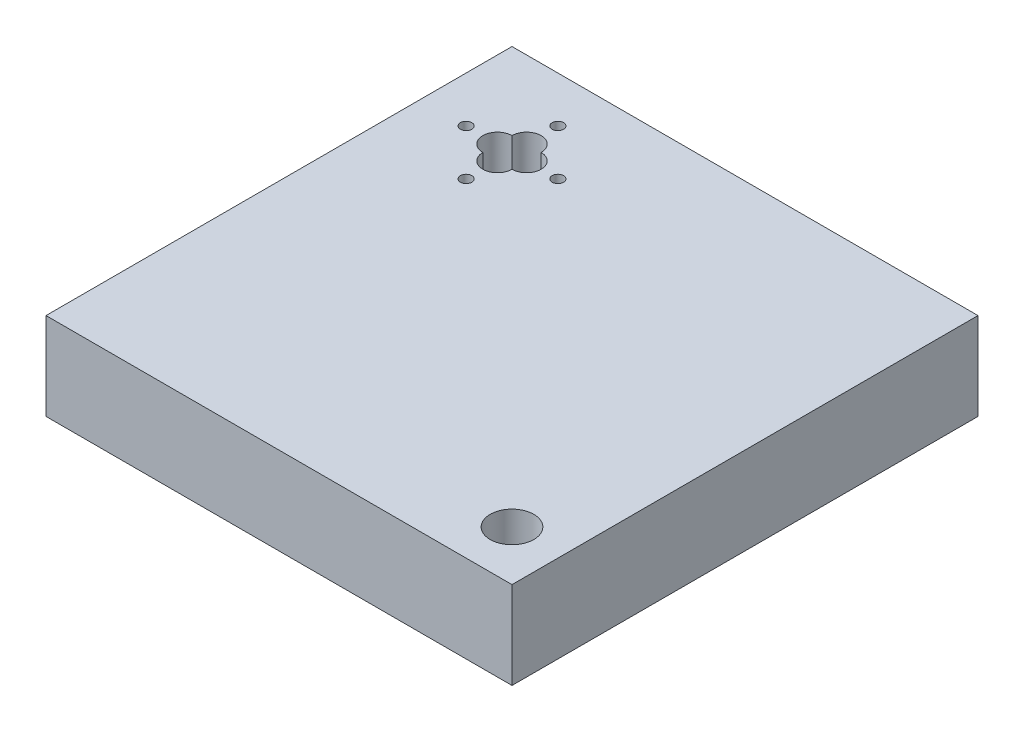
ISO-10303-21;
HEADER;
FILE_DESCRIPTION(('STEP AP214'),'2;1');
FILE_NAME('part.step','',(''),(''),'','','');
FILE_SCHEMA(('AUTOMOTIVE_DESIGN { 1 0 10303 214 1 1 1 1 }'));
ENDSEC;
DATA;
#1=APPLICATION_CONTEXT('core data for automotive mechanical design processes');
#2=APPLICATION_PROTOCOL_DEFINITION('international standard','automotive_design',2000,#1);
#3=PRODUCT_CONTEXT('',#1,'mechanical');
#4=PRODUCT('Part','Part','',(#3));
#5=PRODUCT_RELATED_PRODUCT_CATEGORY('part','',(#4));
#6=PRODUCT_DEFINITION_FORMATION('','',#4);
#7=PRODUCT_DEFINITION_CONTEXT('part definition',#1,'design');
#8=PRODUCT_DEFINITION('design','',#6,#7);
#9=PRODUCT_DEFINITION_SHAPE('','',#8);
#10=(LENGTH_UNIT() NAMED_UNIT(*) SI_UNIT(.MILLI.,.METRE.));
#11=(NAMED_UNIT(*) PLANE_ANGLE_UNIT() SI_UNIT($,.RADIAN.));
#12=(NAMED_UNIT(*) SI_UNIT($,.STERADIAN.) SOLID_ANGLE_UNIT());
#13=UNCERTAINTY_MEASURE_WITH_UNIT(LENGTH_MEASURE(1.E-05),#10,'distance_accuracy_value','');
#14=(GEOMETRIC_REPRESENTATION_CONTEXT(3) GLOBAL_UNCERTAINTY_ASSIGNED_CONTEXT((#13)) GLOBAL_UNIT_ASSIGNED_CONTEXT((#10,
#11,#12)) REPRESENTATION_CONTEXT('',''));
#15=CARTESIAN_POINT('',(0.,0.,0.));
#16=DIRECTION('',(0.,0.,1.));
#17=DIRECTION('',(1.,0.,0.));
#18=AXIS2_PLACEMENT_3D('',#15,#16,#17);
#19=CARTESIAN_POINT('',(81.6,-19.05,0.));
#20=DIRECTION('',(-1.,0.,0.));
#21=DIRECTION('',(0.,0.,1.));
#22=AXIS2_PLACEMENT_3D('',#19,#20,#21);
#23=PLANE('',#22);
#24=DIRECTION('',(0.,0.,1.));
#25=VECTOR('',#24,1.);
#26=CARTESIAN_POINT('',(81.6,0.,0.));
#27=LINE('',#26,#25);
#28=CARTESIAN_POINT('',(81.6,0.,-20.));
#29=VERTEX_POINT('',#28);
#30=CARTESIAN_POINT('',(81.6,0.,81.6));
#31=VERTEX_POINT('',#30);
#32=EDGE_CURVE('E156',#29,#31,#27,.T.);
#33=ORIENTED_EDGE('',*,*,#32,.T.);
#34=DIRECTION('',(0.,1.,0.));
#35=VECTOR('',#34,1.);
#36=CARTESIAN_POINT('',(81.6,-19.05,81.6));
#37=LINE('',#36,#35);
#38=CARTESIAN_POINT('',(81.6,-19.05,81.6));
#39=VERTEX_POINT('',#38);
#40=EDGE_CURVE('E11',#39,#31,#37,.T.);
#41=ORIENTED_EDGE('',*,*,#40,.F.);
#42=DIRECTION('',(0.,0.,1.));
#43=VECTOR('',#42,1.);
#44=CARTESIAN_POINT('',(81.6,-19.05,0.));
#45=LINE('',#44,#43);
#46=CARTESIAN_POINT('',(81.6,-19.05,-20.));
#47=VERTEX_POINT('',#46);
#48=EDGE_CURVE('E59',#47,#39,#45,.T.);
#49=ORIENTED_EDGE('',*,*,#48,.F.);
#50=DIRECTION('',(0.,1.,0.));
#51=VECTOR('',#50,1.);
#52=CARTESIAN_POINT('',(81.6,-19.05,-20.));
#53=LINE('',#52,#51);
#54=EDGE_CURVE('E122',#47,#29,#53,.T.);
#55=ORIENTED_EDGE('',*,*,#54,.T.);
#56=EDGE_LOOP('',(#33,#41,#49,#55));
#57=FACE_BOUND('',#56,.T.);
#58=ADVANCED_FACE('F39',(#57),#23,.F.);
#59=CARTESIAN_POINT('',(0.,-19.05,81.6));
#60=DIRECTION('',(0.,0.,1.));
#61=DIRECTION('',(1.,0.,0.));
#62=AXIS2_PLACEMENT_3D('',#59,#60,#61);
#63=PLANE('',#62);
#64=DIRECTION('',(1.,0.,0.));
#65=VECTOR('',#64,1.);
#66=CARTESIAN_POINT('',(0.,0.,81.6));
#67=LINE('',#66,#65);
#68=CARTESIAN_POINT('',(-20.,0.,81.6));
#69=VERTEX_POINT('',#68);
#70=EDGE_CURVE('E164',#69,#31,#67,.T.);
#71=ORIENTED_EDGE('',*,*,#70,.F.);
#72=DIRECTION('',(0.,1.,0.));
#73=VECTOR('',#72,1.);
#74=CARTESIAN_POINT('',(-20.,-19.05,81.6));
#75=LINE('',#74,#73);
#76=CARTESIAN_POINT('',(-20.,-19.05,81.6));
#77=VERTEX_POINT('',#76);
#78=EDGE_CURVE('E50',#77,#69,#75,.T.);
#79=ORIENTED_EDGE('',*,*,#78,.F.);
#80=DIRECTION('',(1.,0.,0.));
#81=VECTOR('',#80,1.);
#82=CARTESIAN_POINT('',(0.,-19.05,81.6));
#83=LINE('',#82,#81);
#84=EDGE_CURVE('E131',#77,#39,#83,.T.);
#85=ORIENTED_EDGE('',*,*,#84,.T.);
#86=ORIENTED_EDGE('',*,*,#40,.T.);
#87=EDGE_LOOP('',(#71,#79,#85,#86));
#88=FACE_BOUND('',#87,.T.);
#89=ADVANCED_FACE('F234',(#88),#63,.T.);
#90=CARTESIAN_POINT('',(-20.,-19.05,0.));
#91=DIRECTION('',(-1.,0.,0.));
#92=DIRECTION('',(0.,0.,1.));
#93=AXIS2_PLACEMENT_3D('',#90,#91,#92);
#94=PLANE('',#93);
#95=DIRECTION('',(0.,0.,1.));
#96=VECTOR('',#95,1.);
#97=CARTESIAN_POINT('',(-20.,0.,0.));
#98=LINE('',#97,#96);
#99=CARTESIAN_POINT('',(-20.,0.,-20.));
#100=VERTEX_POINT('',#99);
#101=EDGE_CURVE('E118',#100,#69,#98,.T.);
#102=ORIENTED_EDGE('',*,*,#101,.F.);
#103=DIRECTION('',(0.,1.,0.));
#104=VECTOR('',#103,1.);
#105=CARTESIAN_POINT('',(-20.,-19.05,-20.));
#106=LINE('',#105,#104);
#107=CARTESIAN_POINT('',(-20.,-19.05,-20.));
#108=VERTEX_POINT('',#107);
#109=EDGE_CURVE('E113',#108,#100,#106,.T.);
#110=ORIENTED_EDGE('',*,*,#109,.F.);
#111=DIRECTION('',(0.,0.,1.));
#112=VECTOR('',#111,1.);
#113=CARTESIAN_POINT('',(-20.,-19.05,0.));
#114=LINE('',#113,#112);
#115=EDGE_CURVE('E117',#108,#77,#114,.T.);
#116=ORIENTED_EDGE('',*,*,#115,.T.);
#117=ORIENTED_EDGE('',*,*,#78,.T.);
#118=EDGE_LOOP('',(#102,#110,#116,#117));
#119=FACE_BOUND('',#118,.T.);
#120=ADVANCED_FACE('F115',(#119),#94,.T.);
#121=CARTESIAN_POINT('',(0.,-19.05,3.18));
#122=DIRECTION('',(0.,1.,0.));
#123=DIRECTION('',(0.,0.,1.));
#124=AXIS2_PLACEMENT_3D('',#121,#122,#123);
#125=CYLINDRICAL_SURFACE('',#124,3.18000000000001);
#126=CARTESIAN_POINT('',(0.,0.,3.18));
#127=DIRECTION('',(0.,1.,0.));
#128=DIRECTION('',(0.,0.,1.));
#129=AXIS2_PLACEMENT_3D('',#126,#127,#128);
#130=CIRCLE('',#129,3.18000000000001);
#131=CARTESIAN_POINT('',(-3.18,0.,3.18));
#132=VERTEX_POINT('',#131);
#133=CARTESIAN_POINT('',(3.18,0.,3.18));
#134=VERTEX_POINT('',#133);
#135=EDGE_CURVE('E138',#132,#134,#130,.T.);
#136=ORIENTED_EDGE('',*,*,#135,.T.);
#137=DIRECTION('',(0.,1.,0.));
#138=VECTOR('',#137,1.);
#139=CARTESIAN_POINT('',(3.18,-19.05,3.18));
#140=LINE('',#139,#138);
#141=CARTESIAN_POINT('',(3.18,-19.05,3.18));
#142=VERTEX_POINT('',#141);
#143=EDGE_CURVE('E173',#142,#134,#140,.T.);
#144=ORIENTED_EDGE('',*,*,#143,.F.);
#145=CARTESIAN_POINT('',(0.,-19.05,3.18));
#146=DIRECTION('',(0.,1.,0.));
#147=DIRECTION('',(0.,0.,1.));
#148=AXIS2_PLACEMENT_3D('',#145,#146,#147);
#149=CIRCLE('',#148,3.18000000000001);
#150=CARTESIAN_POINT('',(-3.18,-19.05,3.18));
#151=VERTEX_POINT('',#150);
#152=EDGE_CURVE('E167',#151,#142,#149,.T.);
#153=ORIENTED_EDGE('',*,*,#152,.F.);
#154=DIRECTION('',(0.,1.,0.));
#155=VECTOR('',#154,1.);
#156=CARTESIAN_POINT('',(-3.18,-19.05,3.18));
#157=LINE('',#156,#155);
#158=EDGE_CURVE('E43',#151,#132,#157,.T.);
#159=ORIENTED_EDGE('',*,*,#158,.T.);
#160=EDGE_LOOP('',(#136,#144,#153,#159));
#161=FACE_BOUND('',#160,.T.);
#162=ADVANCED_FACE('F41',(#161),#125,.F.);
#163=CARTESIAN_POINT('',(3.18,-19.05,0.));
#164=DIRECTION('',(0.,1.,0.));
#165=DIRECTION('',(0.,0.,1.));
#166=AXIS2_PLACEMENT_3D('',#163,#164,#165);
#167=CYLINDRICAL_SURFACE('',#166,3.18);
#168=CARTESIAN_POINT('',(3.18,0.,0.));
#169=DIRECTION('',(0.,1.,0.));
#170=DIRECTION('',(0.,0.,1.));
#171=AXIS2_PLACEMENT_3D('',#168,#169,#170);
#172=CIRCLE('',#171,3.18);
#173=CARTESIAN_POINT('',(3.18,0.,-3.18));
#174=VERTEX_POINT('',#173);
#175=EDGE_CURVE('E149',#134,#174,#172,.T.);
#176=ORIENTED_EDGE('',*,*,#175,.T.);
#177=DIRECTION('',(0.,1.,0.));
#178=VECTOR('',#177,1.);
#179=CARTESIAN_POINT('',(3.18,-19.05,-3.18));
#180=LINE('',#179,#178);
#181=CARTESIAN_POINT('',(3.18,-19.05,-3.18));
#182=VERTEX_POINT('',#181);
#183=EDGE_CURVE('E177',#182,#174,#180,.T.);
#184=ORIENTED_EDGE('',*,*,#183,.F.);
#185=CARTESIAN_POINT('',(3.18,-19.05,0.));
#186=DIRECTION('',(0.,1.,0.));
#187=DIRECTION('',(0.,0.,1.));
#188=AXIS2_PLACEMENT_3D('',#185,#186,#187);
#189=CIRCLE('',#188,3.18);
#190=EDGE_CURVE('E199',#142,#182,#189,.T.);
#191=ORIENTED_EDGE('',*,*,#190,.F.);
#192=ORIENTED_EDGE('',*,*,#143,.T.);
#193=EDGE_LOOP('',(#176,#184,#191,#192));
#194=FACE_BOUND('',#193,.T.);
#195=ADVANCED_FACE('F198',(#194),#167,.F.);
#196=CARTESIAN_POINT('',(0.,-19.05,-3.18));
#197=DIRECTION('',(0.,1.,0.));
#198=DIRECTION('',(0.,0.,1.));
#199=AXIS2_PLACEMENT_3D('',#196,#197,#198);
#200=CYLINDRICAL_SURFACE('',#199,3.18);
#201=CARTESIAN_POINT('',(0.,0.,-3.18));
#202=DIRECTION('',(0.,1.,0.));
#203=DIRECTION('',(0.,0.,1.));
#204=AXIS2_PLACEMENT_3D('',#201,#202,#203);
#205=CIRCLE('',#204,3.18);
#206=CARTESIAN_POINT('',(-3.18,0.,-3.18));
#207=VERTEX_POINT('',#206);
#208=EDGE_CURVE('E146',#174,#207,#205,.T.);
#209=ORIENTED_EDGE('',*,*,#208,.T.);
#210=DIRECTION('',(0.,1.,0.));
#211=VECTOR('',#210,1.);
#212=CARTESIAN_POINT('',(-3.18,-19.05,-3.18));
#213=LINE('',#212,#211);
#214=CARTESIAN_POINT('',(-3.18,-19.05,-3.18));
#215=VERTEX_POINT('',#214);
#216=EDGE_CURVE('E180',#215,#207,#213,.T.);
#217=ORIENTED_EDGE('',*,*,#216,.F.);
#218=CARTESIAN_POINT('',(0.,-19.05,-3.18));
#219=DIRECTION('',(0.,1.,0.));
#220=DIRECTION('',(0.,0.,1.));
#221=AXIS2_PLACEMENT_3D('',#218,#219,#220);
#222=CIRCLE('',#221,3.18);
#223=EDGE_CURVE('E203',#182,#215,#222,.T.);
#224=ORIENTED_EDGE('',*,*,#223,.F.);
#225=ORIENTED_EDGE('',*,*,#183,.T.);
#226=EDGE_LOOP('',(#209,#217,#224,#225));
#227=FACE_BOUND('',#226,.T.);
#228=ADVANCED_FACE('F224',(#227),#200,.F.);
#229=CARTESIAN_POINT('',(70.7106781186546,-19.05,70.7106781186549));
#230=DIRECTION('',(0.,1.,0.));
#231=DIRECTION('',(0.,0.,1.));
#232=AXIS2_PLACEMENT_3D('',#229,#230,#231);
#233=CYLINDRICAL_SURFACE('',#232,4.7625);
#234=CARTESIAN_POINT('',(70.7106781186546,-19.05,70.7106781186549));
#235=DIRECTION('',(0.,1.,0.));
#236=DIRECTION('',(0.,0.,1.));
#237=AXIS2_PLACEMENT_3D('',#234,#235,#236);
#238=CIRCLE('',#237,4.7625);
#239=CARTESIAN_POINT('',(70.7106781186546,-19.05,75.4731781186549));
#240=VERTEX_POINT('',#239);
#241=EDGE_CURVE('E202',#240,#240,#238,.T.);
#242=CARTESIAN_POINT('',(70.7106781186546,0.,70.7106781186549));
#243=DIRECTION('',(0.,1.,0.));
#244=DIRECTION('',(0.,0.,1.));
#245=AXIS2_PLACEMENT_3D('',#242,#243,#244);
#246=CIRCLE('',#245,4.7625);
#247=CARTESIAN_POINT('',(70.7106781186546,0.,75.4731781186549));
#248=VERTEX_POINT('',#247);
#249=EDGE_CURVE('E152',#248,#248,#246,.T.);
#250=CARTESIAN_POINT('',(70.7106781186546,-19.05,75.4731781186549));
#251=CARTESIAN_POINT('',(70.7106781186546,-18.8515625,75.4731781186549));
#252=CARTESIAN_POINT('',(70.7106781186546,-18.653125,75.4731781186549));
#253=CARTESIAN_POINT('',(70.7106781186546,-18.25625,75.4731781186549));
#254=CARTESIAN_POINT('',(70.7106781186546,-18.0578125,75.4731781186549));
#255=CARTESIAN_POINT('',(70.7106781186546,-17.6609375,75.4731781186549));
#256=CARTESIAN_POINT('',(70.7106781186546,-17.4625,75.4731781186549));
#257=CARTESIAN_POINT('',(70.7106781186546,-17.065625,75.4731781186549));
#258=CARTESIAN_POINT('',(70.7106781186546,-16.8671875,75.4731781186549));
#259=CARTESIAN_POINT('',(70.7106781186546,-16.4703125,75.4731781186549));
#260=CARTESIAN_POINT('',(70.7106781186546,-16.271875,75.4731781186549));
#261=CARTESIAN_POINT('',(70.7106781186546,-15.875,75.4731781186549));
#262=CARTESIAN_POINT('',(70.7106781186546,-15.6765625,75.4731781186549));
#263=CARTESIAN_POINT('',(70.7106781186546,-15.2796875,75.4731781186549));
#264=CARTESIAN_POINT('',(70.7106781186546,-15.08125,75.4731781186549));
#265=CARTESIAN_POINT('',(70.7106781186546,-14.684375,75.4731781186549));
#266=CARTESIAN_POINT('',(70.7106781186546,-14.4859375,75.4731781186549));
#267=CARTESIAN_POINT('',(70.7106781186546,-14.0890625,75.4731781186549));
#268=CARTESIAN_POINT('',(70.7106781186546,-13.890625,75.4731781186549));
#269=CARTESIAN_POINT('',(70.7106781186546,-13.49375,75.4731781186549));
#270=CARTESIAN_POINT('',(70.7106781186546,-13.2953125,75.4731781186549));
#271=CARTESIAN_POINT('',(70.7106781186546,-12.8984375,75.4731781186549));
#272=CARTESIAN_POINT('',(70.7106781186546,-12.7,75.4731781186549));
#273=CARTESIAN_POINT('',(70.7106781186546,-12.303125,75.4731781186549));
#274=CARTESIAN_POINT('',(70.7106781186546,-12.1046875,75.4731781186549));
#275=CARTESIAN_POINT('',(70.7106781186546,-11.7078125,75.4731781186549));
#276=CARTESIAN_POINT('',(70.7106781186546,-11.509375,75.4731781186549));
#277=CARTESIAN_POINT('',(70.7106781186546,-11.1125,75.4731781186549));
#278=CARTESIAN_POINT('',(70.7106781186546,-10.9140625,75.4731781186549));
#279=CARTESIAN_POINT('',(70.7106781186546,-10.5171875,75.4731781186549));
#280=CARTESIAN_POINT('',(70.7106781186546,-10.31875,75.4731781186549));
#281=CARTESIAN_POINT('',(70.7106781186546,-9.921875,75.4731781186549));
#282=CARTESIAN_POINT('',(70.7106781186546,-9.7234375,75.4731781186549));
#283=CARTESIAN_POINT('',(70.7106781186546,-9.3265625,75.4731781186549));
#284=CARTESIAN_POINT('',(70.7106781186546,-9.128125,75.4731781186549));
#285=CARTESIAN_POINT('',(70.7106781186546,-8.73125,75.4731781186549));
#286=CARTESIAN_POINT('',(70.7106781186546,-8.5328125,75.4731781186549));
#287=CARTESIAN_POINT('',(70.7106781186546,-8.1359375,75.4731781186549));
#288=CARTESIAN_POINT('',(70.7106781186546,-7.9375,75.4731781186549));
#289=CARTESIAN_POINT('',(70.7106781186546,-7.540625,75.4731781186549));
#290=CARTESIAN_POINT('',(70.7106781186546,-7.3421875,75.4731781186549));
#291=CARTESIAN_POINT('',(70.7106781186546,-6.9453125,75.4731781186549));
#292=CARTESIAN_POINT('',(70.7106781186546,-6.746875,75.4731781186549));
#293=CARTESIAN_POINT('',(70.7106781186546,-6.35,75.4731781186549));
#294=CARTESIAN_POINT('',(70.7106781186546,-6.1515625,75.4731781186549));
#295=CARTESIAN_POINT('',(70.7106781186546,-5.7546875,75.4731781186549));
#296=CARTESIAN_POINT('',(70.7106781186546,-5.55625,75.4731781186549));
#297=CARTESIAN_POINT('',(70.7106781186546,-5.159375,75.4731781186549));
#298=CARTESIAN_POINT('',(70.7106781186546,-4.9609375,75.4731781186549));
#299=CARTESIAN_POINT('',(70.7106781186546,-4.5640625,75.4731781186549));
#300=CARTESIAN_POINT('',(70.7106781186546,-4.365625,75.4731781186549));
#301=CARTESIAN_POINT('',(70.7106781186546,-3.96875,75.4731781186549));
#302=CARTESIAN_POINT('',(70.7106781186546,-3.7703125,75.4731781186549));
#303=CARTESIAN_POINT('',(70.7106781186546,-3.3734375,75.4731781186549));
#304=CARTESIAN_POINT('',(70.7106781186546,-3.175,75.4731781186549));
#305=CARTESIAN_POINT('',(70.7106781186546,-2.778125,75.4731781186549));
#306=CARTESIAN_POINT('',(70.7106781186546,-2.5796875,75.4731781186549));
#307=CARTESIAN_POINT('',(70.7106781186546,-2.1828125,75.4731781186549));
#308=CARTESIAN_POINT('',(70.7106781186546,-1.984375,75.4731781186549));
#309=CARTESIAN_POINT('',(70.7106781186546,-1.5875,75.4731781186549));
#310=CARTESIAN_POINT('',(70.7106781186546,-1.3890625,75.4731781186549));
#311=CARTESIAN_POINT('',(70.7106781186546,-0.992187500000001,75.4731781186549));
#312=CARTESIAN_POINT('',(70.7106781186546,-0.793750000000001,75.4731781186549));
#313=CARTESIAN_POINT('',(70.7106781186546,-0.396875,75.4731781186549));
#314=CARTESIAN_POINT('',(70.7106781186546,-0.1984375,75.4731781186549));
#315=CARTESIAN_POINT('',(70.7106781186546,0.,75.4731781186549));
#316=B_SPLINE_CURVE_WITH_KNOTS('',3,(#250,#251,#252,#253,#254,#255,#256,#257,#258,#259,#260,
#261,#262,#263,#264,#265,#266,#267,#268,#269,#270,#271,#272,#273,#274,#275,#276,#277,#278,#279,
#280,#281,#282,#283,#284,#285,#286,#287,#288,#289,#290,#291,#292,#293,#294,#295,#296,#297,#298,
#299,#300,#301,#302,#303,#304,#305,#306,#307,#308,#309,#310,#311,#312,#313,#314,#315),
.UNSPECIFIED.,.F.,.F.,(4,2,2,2,2,2,2,2,2,2,2,2,2,2,2,2,2,2,2,2,2,2,2,2,2,2,2,2,2,2,2,2,4),(0.,
0.595312499999997,1.190625,1.7859375,2.38125,2.9765625,3.571875,4.1671875,4.7625,5.3578125,
5.953125,6.5484375,7.14375,7.7390625,8.334375,8.9296875,9.525,10.1203125,10.715625,11.3109375,
11.90625,12.5015625,13.096875,13.6921875,14.2875,14.8828125,15.478125,16.0734375,16.66875,
17.2640625,17.859375,18.4546875,19.05),.UNSPECIFIED.);
#317=EDGE_CURVE('BSEAM220',#240,#248,#316,.T.);
#318=ORIENTED_EDGE('',*,*,#241,.F.);
#319=ORIENTED_EDGE('',*,*,#249,.T.);
#320=ORIENTED_EDGE('',*,*,#317,.T.);
#321=ORIENTED_EDGE('',*,*,#317,.F.);
#322=EDGE_LOOP('',(#318,#320,#319,#321));
#323=FACE_BOUND('',#322,.T.);
#324=ADVANCED_FACE('F220',(#323),#233,.F.);
#325=CARTESIAN_POINT('',(-3.18,-19.05,0.));
#326=DIRECTION('',(0.,1.,0.));
#327=DIRECTION('',(0.,0.,1.));
#328=AXIS2_PLACEMENT_3D('',#325,#326,#327);
#329=CYLINDRICAL_SURFACE('',#328,3.18);
#330=CARTESIAN_POINT('',(-3.18,0.,0.));
#331=DIRECTION('',(0.,1.,0.));
#332=DIRECTION('',(0.,0.,1.));
#333=AXIS2_PLACEMENT_3D('',#330,#331,#332);
#334=CIRCLE('',#333,3.18);
#335=EDGE_CURVE('E142',#207,#132,#334,.T.);
#336=ORIENTED_EDGE('',*,*,#335,.T.);
#337=ORIENTED_EDGE('',*,*,#158,.F.);
#338=CARTESIAN_POINT('',(-3.18,-19.05,0.));
#339=DIRECTION('',(0.,1.,0.));
#340=DIRECTION('',(0.,0.,1.));
#341=AXIS2_PLACEMENT_3D('',#338,#339,#340);
#342=CIRCLE('',#341,3.18);
#343=EDGE_CURVE('E101',#215,#151,#342,.T.);
#344=ORIENTED_EDGE('',*,*,#343,.F.);
#345=ORIENTED_EDGE('',*,*,#216,.T.);
#346=EDGE_LOOP('',(#336,#337,#344,#345));
#347=FACE_BOUND('',#346,.T.);
#348=ADVANCED_FACE('F223',(#347),#329,.F.);
#349=CARTESIAN_POINT('',(0.,-19.05,-20.));
#350=DIRECTION('',(0.,0.,1.));
#351=DIRECTION('',(1.,0.,0.));
#352=AXIS2_PLACEMENT_3D('',#349,#350,#351);
#353=PLANE('',#352);
#354=DIRECTION('',(1.,0.,0.));
#355=VECTOR('',#354,1.);
#356=CARTESIAN_POINT('',(0.,0.,-20.));
#357=LINE('',#356,#355);
#358=EDGE_CURVE('E159',#100,#29,#357,.T.);
#359=ORIENTED_EDGE('',*,*,#358,.T.);
#360=ORIENTED_EDGE('',*,*,#54,.F.);
#361=DIRECTION('',(1.,0.,0.));
#362=VECTOR('',#361,1.);
#363=CARTESIAN_POINT('',(0.,-19.05,-20.));
#364=LINE('',#363,#362);
#365=EDGE_CURVE('E125',#108,#47,#364,.T.);
#366=ORIENTED_EDGE('',*,*,#365,.F.);
#367=ORIENTED_EDGE('',*,*,#109,.T.);
#368=EDGE_LOOP('',(#359,#360,#366,#367));
#369=FACE_BOUND('',#368,.T.);
#370=ADVANCED_FACE('F126',(#369),#353,.F.);
#371=CARTESIAN_POINT('',(0.,-19.05,0.));
#372=DIRECTION('',(0.,1.,0.));
#373=DIRECTION('',(0.,0.,1.));
#374=AXIS2_PLACEMENT_3D('',#371,#372,#373);
#375=PLANE('',#374);
#376=CARTESIAN_POINT('',(0.,-19.05,-10.));
#377=DIRECTION('',(0.,1.,0.));
#378=DIRECTION('',(0.,0.,1.));
#379=AXIS2_PLACEMENT_3D('',#376,#377,#378);
#380=CIRCLE('',#379,1.25);
#381=CARTESIAN_POINT('',(0.,-19.05,-8.75));
#382=VERTEX_POINT('',#381);
#383=EDGE_CURVE('E361',#382,#382,#380,.T.);
#384=ORIENTED_EDGE('',*,*,#383,.T.);
#385=EDGE_LOOP('',(#384));
#386=FACE_BOUND('',#385,.T.);
#387=CARTESIAN_POINT('',(10.,-19.05,0.));
#388=DIRECTION('',(0.,1.,0.));
#389=DIRECTION('',(0.,0.,1.));
#390=AXIS2_PLACEMENT_3D('',#387,#388,#389);
#391=CIRCLE('',#390,1.25);
#392=CARTESIAN_POINT('',(10.,-19.05,1.25));
#393=VERTEX_POINT('',#392);
#394=EDGE_CURVE('E374',#393,#393,#391,.T.);
#395=ORIENTED_EDGE('',*,*,#394,.T.);
#396=EDGE_LOOP('',(#395));
#397=FACE_BOUND('',#396,.T.);
#398=CARTESIAN_POINT('',(0.,-19.05,10.));
#399=DIRECTION('',(0.,1.,0.));
#400=DIRECTION('',(0.,0.,1.));
#401=AXIS2_PLACEMENT_3D('',#398,#399,#400);
#402=CIRCLE('',#401,1.25);
#403=CARTESIAN_POINT('',(0.,-19.05,11.25));
#404=VERTEX_POINT('',#403);
#405=EDGE_CURVE('E382',#404,#404,#402,.T.);
#406=ORIENTED_EDGE('',*,*,#405,.T.);
#407=EDGE_LOOP('',(#406));
#408=FACE_BOUND('',#407,.T.);
#409=CARTESIAN_POINT('',(-10.,-19.05,0.));
#410=DIRECTION('',(0.,1.,0.));
#411=DIRECTION('',(0.,0.,1.));
#412=AXIS2_PLACEMENT_3D('',#409,#410,#411);
#413=CIRCLE('',#412,1.25);
#414=CARTESIAN_POINT('',(-10.,-19.05,1.25));
#415=VERTEX_POINT('',#414);
#416=EDGE_CURVE('E143',#415,#415,#413,.T.);
#417=ORIENTED_EDGE('',*,*,#416,.T.);
#418=EDGE_LOOP('',(#417));
#419=FACE_BOUND('',#418,.T.);
#420=ORIENTED_EDGE('',*,*,#152,.T.);
#421=ORIENTED_EDGE('',*,*,#190,.T.);
#422=ORIENTED_EDGE('',*,*,#223,.T.);
#423=ORIENTED_EDGE('',*,*,#343,.T.);
#424=EDGE_LOOP('',(#420,#421,#422,#423));
#425=FACE_BOUND('',#424,.T.);
#426=ORIENTED_EDGE('',*,*,#241,.T.);
#427=EDGE_LOOP('',(#426));
#428=FACE_BOUND('',#427,.T.);
#429=ORIENTED_EDGE('',*,*,#48,.T.);
#430=ORIENTED_EDGE('',*,*,#84,.F.);
#431=ORIENTED_EDGE('',*,*,#115,.F.);
#432=ORIENTED_EDGE('',*,*,#365,.T.);
#433=EDGE_LOOP('',(#429,#430,#431,#432));
#434=FACE_BOUND('',#433,.T.);
#435=ADVANCED_FACE('F130',(#386,#397,#408,#419,#425,#428,#434),#375,.F.);
#436=CARTESIAN_POINT('',(0.,0.,0.));
#437=DIRECTION('',(0.,1.,0.));
#438=DIRECTION('',(0.,0.,1.));
#439=AXIS2_PLACEMENT_3D('',#436,#437,#438);
#440=PLANE('',#439);
#441=CARTESIAN_POINT('',(0.,0.,-10.));
#442=DIRECTION('',(0.,1.,0.));
#443=DIRECTION('',(0.,0.,1.));
#444=AXIS2_PLACEMENT_3D('',#441,#442,#443);
#445=CIRCLE('',#444,1.25);
#446=CARTESIAN_POINT('',(0.,0.,-8.75));
#447=VERTEX_POINT('',#446);
#448=EDGE_CURVE('E364',#447,#447,#445,.T.);
#449=ORIENTED_EDGE('',*,*,#448,.F.);
#450=EDGE_LOOP('',(#449));
#451=FACE_BOUND('',#450,.T.);
#452=CARTESIAN_POINT('',(10.,0.,0.));
#453=DIRECTION('',(0.,1.,0.));
#454=DIRECTION('',(0.,0.,1.));
#455=AXIS2_PLACEMENT_3D('',#452,#453,#454);
#456=CIRCLE('',#455,1.25);
#457=CARTESIAN_POINT('',(10.,0.,1.25));
#458=VERTEX_POINT('',#457);
#459=EDGE_CURVE('E368',#458,#458,#456,.T.);
#460=ORIENTED_EDGE('',*,*,#459,.F.);
#461=EDGE_LOOP('',(#460));
#462=FACE_BOUND('',#461,.T.);
#463=CARTESIAN_POINT('',(0.,0.,10.));
#464=DIRECTION('',(0.,1.,0.));
#465=DIRECTION('',(0.,0.,1.));
#466=AXIS2_PLACEMENT_3D('',#463,#464,#465);
#467=CIRCLE('',#466,1.25);
#468=CARTESIAN_POINT('',(0.,0.,11.25));
#469=VERTEX_POINT('',#468);
#470=EDGE_CURVE('E378',#469,#469,#467,.T.);
#471=ORIENTED_EDGE('',*,*,#470,.F.);
#472=EDGE_LOOP('',(#471));
#473=FACE_BOUND('',#472,.T.);
#474=CARTESIAN_POINT('',(-10.,0.,0.));
#475=DIRECTION('',(0.,1.,0.));
#476=DIRECTION('',(0.,0.,1.));
#477=AXIS2_PLACEMENT_3D('',#474,#475,#476);
#478=CIRCLE('',#477,1.25);
#479=CARTESIAN_POINT('',(-10.,0.,1.25));
#480=VERTEX_POINT('',#479);
#481=EDGE_CURVE('E385',#480,#480,#478,.T.);
#482=ORIENTED_EDGE('',*,*,#481,.F.);
#483=EDGE_LOOP('',(#482));
#484=FACE_BOUND('',#483,.T.);
#485=ORIENTED_EDGE('',*,*,#135,.F.);
#486=ORIENTED_EDGE('',*,*,#335,.F.);
#487=ORIENTED_EDGE('',*,*,#208,.F.);
#488=ORIENTED_EDGE('',*,*,#175,.F.);
#489=EDGE_LOOP('',(#485,#486,#487,#488));
#490=FACE_BOUND('',#489,.T.);
#491=ORIENTED_EDGE('',*,*,#249,.F.);
#492=EDGE_LOOP('',(#491));
#493=FACE_BOUND('',#492,.T.);
#494=ORIENTED_EDGE('',*,*,#32,.F.);
#495=ORIENTED_EDGE('',*,*,#358,.F.);
#496=ORIENTED_EDGE('',*,*,#101,.T.);
#497=ORIENTED_EDGE('',*,*,#70,.T.);
#498=EDGE_LOOP('',(#494,#495,#496,#497));
#499=FACE_BOUND('',#498,.T.);
#500=ADVANCED_FACE('F193',(#451,#462,#473,#484,#490,#493,#499),#440,.T.);
#501=CARTESIAN_POINT('',(-10.,0.,0.));
#502=DIRECTION('',(0.,1.,0.));
#503=DIRECTION('',(0.,0.,1.));
#504=AXIS2_PLACEMENT_3D('',#501,#502,#503);
#505=CYLINDRICAL_SURFACE('',#504,1.25);
#506=ORIENTED_EDGE('',*,*,#416,.F.);
#507=EDGE_LOOP('',(#506));
#508=FACE_BOUND('',#507,.T.);
#509=ORIENTED_EDGE('',*,*,#481,.T.);
#510=EDGE_LOOP('',(#509));
#511=FACE_BOUND('',#510,.T.);
#512=ADVANCED_FACE('F229',(#508,#511),#505,.F.);
#513=CARTESIAN_POINT('',(0.,0.,10.));
#514=DIRECTION('',(0.,1.,0.));
#515=DIRECTION('',(0.,0.,1.));
#516=AXIS2_PLACEMENT_3D('',#513,#514,#515);
#517=CYLINDRICAL_SURFACE('',#516,1.25);
#518=ORIENTED_EDGE('',*,*,#405,.F.);
#519=EDGE_LOOP('',(#518));
#520=FACE_BOUND('',#519,.T.);
#521=ORIENTED_EDGE('',*,*,#470,.T.);
#522=EDGE_LOOP('',(#521));
#523=FACE_BOUND('',#522,.T.);
#524=ADVANCED_FACE('F276',(#520,#523),#517,.F.);
#525=CARTESIAN_POINT('',(10.,0.,0.));
#526=DIRECTION('',(0.,1.,0.));
#527=DIRECTION('',(0.,0.,1.));
#528=AXIS2_PLACEMENT_3D('',#525,#526,#527);
#529=CYLINDRICAL_SURFACE('',#528,1.25);
#530=ORIENTED_EDGE('',*,*,#394,.F.);
#531=EDGE_LOOP('',(#530));
#532=FACE_BOUND('',#531,.T.);
#533=ORIENTED_EDGE('',*,*,#459,.T.);
#534=EDGE_LOOP('',(#533));
#535=FACE_BOUND('',#534,.T.);
#536=ADVANCED_FACE('F284',(#532,#535),#529,.F.);
#537=CARTESIAN_POINT('',(0.,0.,-10.));
#538=DIRECTION('',(0.,1.,0.));
#539=DIRECTION('',(0.,0.,1.));
#540=AXIS2_PLACEMENT_3D('',#537,#538,#539);
#541=CYLINDRICAL_SURFACE('',#540,1.25);
#542=ORIENTED_EDGE('',*,*,#383,.F.);
#543=EDGE_LOOP('',(#542));
#544=FACE_BOUND('',#543,.T.);
#545=ORIENTED_EDGE('',*,*,#448,.T.);
#546=EDGE_LOOP('',(#545));
#547=FACE_BOUND('',#546,.T.);
#548=ADVANCED_FACE('F292',(#544,#547),#541,.F.);
#549=CLOSED_SHELL('',(#58,#89,#120,#162,#195,#228,#324,#348,#370,#435,#500,#512,#524,#536,#548));
#550=MANIFOLD_SOLID_BREP('B2',#549);
#551=ADVANCED_BREP_SHAPE_REPRESENTATION('',(#18,#550),#14);
#552=SHAPE_DEFINITION_REPRESENTATION(#9,#551);
ENDSEC;
END-ISO-10303-21;
